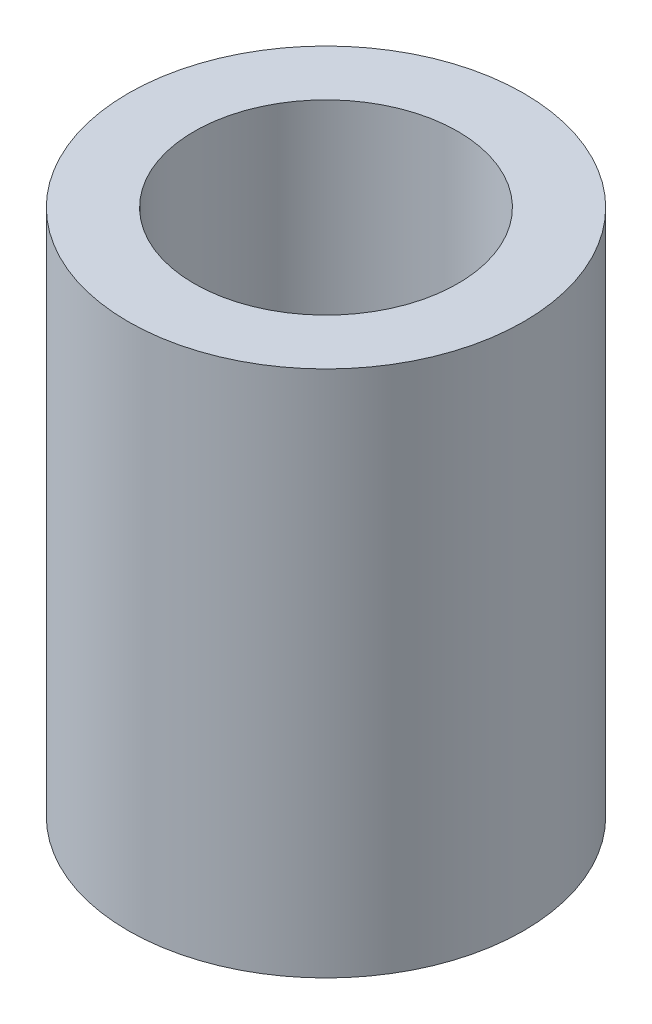
ISO-10303-21;
HEADER;
FILE_DESCRIPTION(('STEP AP214'),'2;1');
FILE_NAME('part.step','',(''),(''),'','','');
FILE_SCHEMA(('AUTOMOTIVE_DESIGN { 1 0 10303 214 1 1 1 1 }'));
ENDSEC;
DATA;
#1=APPLICATION_CONTEXT('core data for automotive mechanical design processes');
#2=APPLICATION_PROTOCOL_DEFINITION('international standard','automotive_design',2000,#1);
#3=PRODUCT_CONTEXT('',#1,'mechanical');
#4=PRODUCT('Part','Part','',(#3));
#5=PRODUCT_RELATED_PRODUCT_CATEGORY('part','',(#4));
#6=PRODUCT_DEFINITION_FORMATION('','',#4);
#7=PRODUCT_DEFINITION_CONTEXT('part definition',#1,'design');
#8=PRODUCT_DEFINITION('design','',#6,#7);
#9=PRODUCT_DEFINITION_SHAPE('','',#8);
#10=(LENGTH_UNIT() NAMED_UNIT(*) SI_UNIT(.MILLI.,.METRE.));
#11=(NAMED_UNIT(*) PLANE_ANGLE_UNIT() SI_UNIT($,.RADIAN.));
#12=(NAMED_UNIT(*) SI_UNIT($,.STERADIAN.) SOLID_ANGLE_UNIT());
#13=UNCERTAINTY_MEASURE_WITH_UNIT(LENGTH_MEASURE(1.E-05),#10,'distance_accuracy_value','');
#14=(GEOMETRIC_REPRESENTATION_CONTEXT(3) GLOBAL_UNCERTAINTY_ASSIGNED_CONTEXT((#13)) GLOBAL_UNIT_ASSIGNED_CONTEXT((#10,
#11,#12)) REPRESENTATION_CONTEXT('',''));
#15=CARTESIAN_POINT('',(0.,0.,0.));
#16=DIRECTION('',(0.,0.,1.));
#17=DIRECTION('',(1.,0.,0.));
#18=AXIS2_PLACEMENT_3D('',#15,#16,#17);
#19=CARTESIAN_POINT('',(0.,8.,0.));
#20=DIRECTION('',(0.,1.,0.));
#21=DIRECTION('',(0.,0.,1.));
#22=AXIS2_PLACEMENT_3D('',#19,#20,#21);
#23=PLANE('',#22);
#24=CARTESIAN_POINT('',(0.,8.,0.));
#25=DIRECTION('',(0.,1.,0.));
#26=DIRECTION('',(0.,0.,1.));
#27=AXIS2_PLACEMENT_3D('',#24,#25,#26);
#28=CIRCLE('',#27,3.);
#29=CARTESIAN_POINT('',(0.,8.,3.));
#30=VERTEX_POINT('',#29);
#31=EDGE_CURVE('E10',#30,#30,#28,.T.);
#32=ORIENTED_EDGE('',*,*,#31,.T.);
#33=EDGE_LOOP('',(#32));
#34=FACE_BOUND('',#33,.T.);
#35=CARTESIAN_POINT('',(0.,8.,0.));
#36=DIRECTION('',(0.,1.,0.));
#37=DIRECTION('',(0.,0.,1.));
#38=AXIS2_PLACEMENT_3D('',#35,#36,#37);
#39=CIRCLE('',#38,2.);
#40=CARTESIAN_POINT('',(0.,8.,2.));
#41=VERTEX_POINT('',#40);
#42=EDGE_CURVE('E46',#41,#41,#39,.T.);
#43=ORIENTED_EDGE('',*,*,#42,.F.);
#44=EDGE_LOOP('',(#43));
#45=FACE_BOUND('',#44,.T.);
#46=ADVANCED_FACE('F34',(#34,#45),#23,.T.);
#47=CARTESIAN_POINT('',(0.,0.,0.));
#48=DIRECTION('',(0.,1.,0.));
#49=DIRECTION('',(0.,0.,1.));
#50=AXIS2_PLACEMENT_3D('',#47,#48,#49);
#51=PLANE('',#50);
#52=CARTESIAN_POINT('',(0.,0.,0.));
#53=DIRECTION('',(0.,1.,0.));
#54=DIRECTION('',(0.,0.,1.));
#55=AXIS2_PLACEMENT_3D('',#52,#53,#54);
#56=CIRCLE('',#55,3.);
#57=CARTESIAN_POINT('',(0.,0.,3.));
#58=VERTEX_POINT('',#57);
#59=EDGE_CURVE('E39',#58,#58,#56,.T.);
#60=ORIENTED_EDGE('',*,*,#59,.F.);
#61=EDGE_LOOP('',(#60));
#62=FACE_BOUND('',#61,.T.);
#63=CARTESIAN_POINT('',(0.,0.,0.));
#64=DIRECTION('',(0.,1.,0.));
#65=DIRECTION('',(0.,0.,1.));
#66=AXIS2_PLACEMENT_3D('',#63,#64,#65);
#67=CIRCLE('',#66,2.);
#68=CARTESIAN_POINT('',(0.,0.,2.));
#69=VERTEX_POINT('',#68);
#70=EDGE_CURVE('E48',#69,#69,#67,.T.);
#71=ORIENTED_EDGE('',*,*,#70,.T.);
#72=EDGE_LOOP('',(#71));
#73=FACE_BOUND('',#72,.T.);
#74=ADVANCED_FACE('F59',(#62,#73),#51,.F.);
#75=CARTESIAN_POINT('',(0.,8.,0.));
#76=DIRECTION('',(0.,-1.,0.));
#77=DIRECTION('',(0.,0.,-1.));
#78=AXIS2_PLACEMENT_3D('',#75,#76,#77);
#79=CYLINDRICAL_SURFACE('',#78,3.);
#80=ORIENTED_EDGE('',*,*,#31,.F.);
#81=EDGE_LOOP('',(#80));
#82=FACE_BOUND('',#81,.T.);
#83=ORIENTED_EDGE('',*,*,#59,.T.);
#84=EDGE_LOOP('',(#83));
#85=FACE_BOUND('',#84,.T.);
#86=ADVANCED_FACE('F40',(#82,#85),#79,.T.);
#87=CARTESIAN_POINT('',(0.,8.,0.));
#88=DIRECTION('',(0.,-1.,0.));
#89=DIRECTION('',(0.,0.,-1.));
#90=AXIS2_PLACEMENT_3D('',#87,#88,#89);
#91=CYLINDRICAL_SURFACE('',#90,2.);
#92=ORIENTED_EDGE('',*,*,#42,.T.);
#93=EDGE_LOOP('',(#92));
#94=FACE_BOUND('',#93,.T.);
#95=ORIENTED_EDGE('',*,*,#70,.F.);
#96=EDGE_LOOP('',(#95));
#97=FACE_BOUND('',#96,.T.);
#98=ADVANCED_FACE('F53',(#94,#97),#91,.F.);
#99=CLOSED_SHELL('',(#46,#74,#86,#98));
#100=MANIFOLD_SOLID_BREP('B2',#99);
#101=ADVANCED_BREP_SHAPE_REPRESENTATION('',(#18,#100),#14);
#102=SHAPE_DEFINITION_REPRESENTATION(#9,#101);
ENDSEC;
END-ISO-10303-21;
